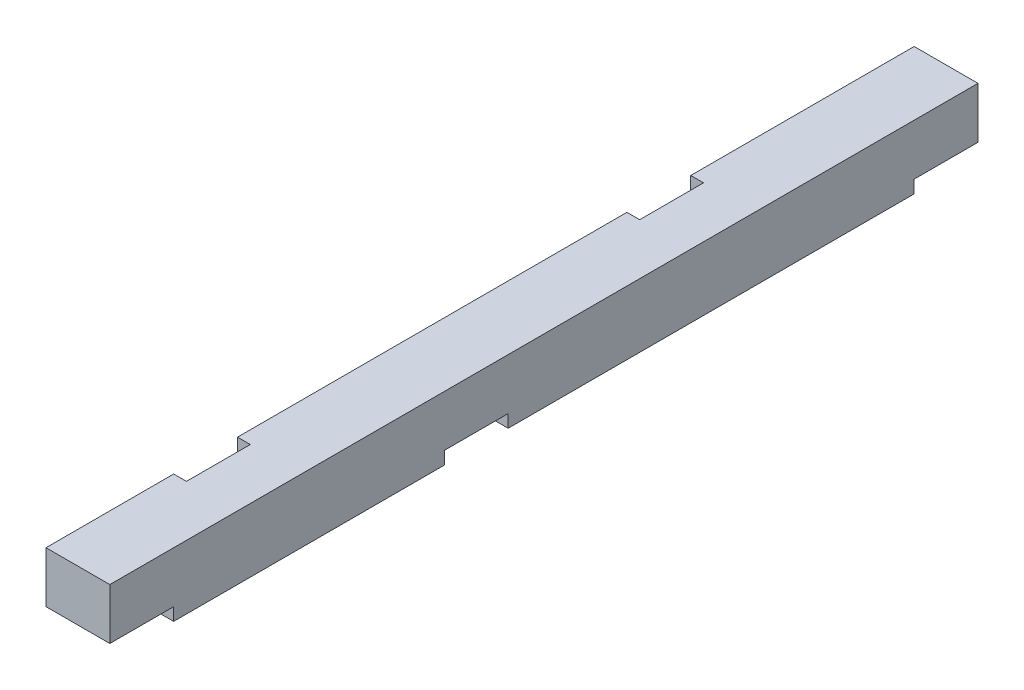
ISO-10303-21;
HEADER;
FILE_DESCRIPTION(('STEP AP214'),'2;1');
FILE_NAME('part.step','',(''),(''),'','','');
FILE_SCHEMA(('AUTOMOTIVE_DESIGN { 1 0 10303 214 1 1 1 1 }'));
ENDSEC;
DATA;
#1=APPLICATION_CONTEXT('core data for automotive mechanical design processes');
#2=APPLICATION_PROTOCOL_DEFINITION('international standard','automotive_design',2000,#1);
#3=PRODUCT_CONTEXT('',#1,'mechanical');
#4=PRODUCT('Part','Part','',(#3));
#5=PRODUCT_RELATED_PRODUCT_CATEGORY('part','',(#4));
#6=PRODUCT_DEFINITION_FORMATION('','',#4);
#7=PRODUCT_DEFINITION_CONTEXT('part definition',#1,'design');
#8=PRODUCT_DEFINITION('design','',#6,#7);
#9=PRODUCT_DEFINITION_SHAPE('','',#8);
#10=(LENGTH_UNIT() NAMED_UNIT(*) SI_UNIT(.MILLI.,.METRE.));
#11=(NAMED_UNIT(*) PLANE_ANGLE_UNIT() SI_UNIT($,.RADIAN.));
#12=(NAMED_UNIT(*) SI_UNIT($,.STERADIAN.) SOLID_ANGLE_UNIT());
#13=UNCERTAINTY_MEASURE_WITH_UNIT(LENGTH_MEASURE(1.E-05),#10,'distance_accuracy_value','');
#14=(GEOMETRIC_REPRESENTATION_CONTEXT(3) GLOBAL_UNCERTAINTY_ASSIGNED_CONTEXT((#13)) GLOBAL_UNIT_ASSIGNED_CONTEXT((#10,
#11,#12)) REPRESENTATION_CONTEXT('',''));
#15=CARTESIAN_POINT('',(0.,0.,0.));
#16=DIRECTION('',(0.,0.,1.));
#17=DIRECTION('',(1.,0.,0.));
#18=AXIS2_PLACEMENT_3D('',#15,#16,#17);
#19=CARTESIAN_POINT('',(0.,0.,136.));
#20=DIRECTION('',(1.,0.,0.));
#21=DIRECTION('',(0.,0.,-1.));
#22=AXIS2_PLACEMENT_3D('',#19,#20,#21);
#23=PLANE('',#22);
#24=DIRECTION('',(0.,0.,-1.));
#25=VECTOR('',#24,1.);
#26=CARTESIAN_POINT('',(0.,0.,136.));
#27=LINE('',#26,#25);
#28=CARTESIAN_POINT('',(0.,0.,106.));
#29=VERTEX_POINT('',#28);
#30=CARTESIAN_POINT('',(0.,0.,83.6));
#31=VERTEX_POINT('',#30);
#32=EDGE_CURVE('E41',#29,#31,#27,.T.);
#33=ORIENTED_EDGE('',*,*,#32,.F.);
#34=DIRECTION('',(0.,-1.,0.));
#35=VECTOR('',#34,1.);
#36=CARTESIAN_POINT('',(0.,10.,106.));
#37=LINE('',#36,#35);
#38=CARTESIAN_POINT('',(0.,10.,106.));
#39=VERTEX_POINT('',#38);
#40=EDGE_CURVE('E177',#39,#29,#37,.T.);
#41=ORIENTED_EDGE('',*,*,#40,.F.);
#42=DIRECTION('',(0.,0.,-1.));
#43=VECTOR('',#42,1.);
#44=CARTESIAN_POINT('',(0.,10.,136.));
#45=LINE('',#44,#43);
#46=CARTESIAN_POINT('',(0.,10.,45.));
#47=VERTEX_POINT('',#46);
#48=EDGE_CURVE('E309',#39,#47,#45,.T.);
#49=ORIENTED_EDGE('',*,*,#48,.T.);
#50=DIRECTION('',(0.,1.,0.));
#51=VECTOR('',#50,1.);
#52=CARTESIAN_POINT('',(0.,10.,45.));
#53=LINE('',#52,#51);
#54=CARTESIAN_POINT('',(0.,0.,45.));
#55=VERTEX_POINT('',#54);
#56=EDGE_CURVE('E209',#55,#47,#53,.T.);
#57=ORIENTED_EDGE('',*,*,#56,.F.);
#58=CARTESIAN_POINT('',(0.,0.,73.6));
#59=VERTEX_POINT('',#58);
#60=EDGE_CURVE('E42',#59,#55,#27,.T.);
#61=ORIENTED_EDGE('',*,*,#60,.F.);
#62=DIRECTION('',(0.,1.,0.));
#63=VECTOR('',#62,1.);
#64=CARTESIAN_POINT('',(0.,2.,73.6));
#65=LINE('',#64,#63);
#66=CARTESIAN_POINT('',(0.,2.,73.6));
#67=VERTEX_POINT('',#66);
#68=EDGE_CURVE('E231',#59,#67,#65,.T.);
#69=ORIENTED_EDGE('',*,*,#68,.T.);
#70=DIRECTION('',(0.,0.,1.));
#71=VECTOR('',#70,1.);
#72=CARTESIAN_POINT('',(0.,2.,83.6));
#73=LINE('',#72,#71);
#74=CARTESIAN_POINT('',(0.,2.,83.6));
#75=VERTEX_POINT('',#74);
#76=EDGE_CURVE('E235',#67,#75,#73,.T.);
#77=ORIENTED_EDGE('',*,*,#76,.T.);
#78=DIRECTION('',(0.,-1.,0.));
#79=VECTOR('',#78,1.);
#80=CARTESIAN_POINT('',(0.,2.,83.6));
#81=LINE('',#80,#79);
#82=EDGE_CURVE('E228',#75,#31,#81,.T.);
#83=ORIENTED_EDGE('',*,*,#82,.T.);
#84=EDGE_LOOP('',(#33,#41,#49,#57,#61,#69,#77,#83));
#85=FACE_BOUND('',#84,.T.);
#86=ADVANCED_FACE('F33',(#85),#23,.F.);
#87=CARTESIAN_POINT('',(0.,0.,35.));
#88=VERTEX_POINT('',#87);
#89=CARTESIAN_POINT('',(0.,0.,10.));
#90=VERTEX_POINT('',#89);
#91=EDGE_CURVE('E314',#88,#90,#27,.T.);
#92=ORIENTED_EDGE('',*,*,#91,.F.);
#93=DIRECTION('',(0.,-1.,0.));
#94=VECTOR('',#93,1.);
#95=CARTESIAN_POINT('',(0.,10.,35.));
#96=LINE('',#95,#94);
#97=CARTESIAN_POINT('',(0.,10.,35.));
#98=VERTEX_POINT('',#97);
#99=EDGE_CURVE('E200',#98,#88,#96,.T.);
#100=ORIENTED_EDGE('',*,*,#99,.F.);
#101=CARTESIAN_POINT('',(0.,10.,0.));
#102=VERTEX_POINT('',#101);
#103=EDGE_CURVE('E298',#98,#102,#45,.T.);
#104=ORIENTED_EDGE('',*,*,#103,.T.);
#105=DIRECTION('',(0.,-1.,0.));
#106=VECTOR('',#105,1.);
#107=CARTESIAN_POINT('',(0.,0.,0.));
#108=LINE('',#107,#106);
#109=CARTESIAN_POINT('',(0.,2.,0.));
#110=VERTEX_POINT('',#109);
#111=EDGE_CURVE('E286',#102,#110,#108,.T.);
#112=ORIENTED_EDGE('',*,*,#111,.T.);
#113=DIRECTION('',(0.,0.,1.));
#114=VECTOR('',#113,1.);
#115=CARTESIAN_POINT('',(0.,2.,10.));
#116=LINE('',#115,#114);
#117=CARTESIAN_POINT('',(0.,2.,10.));
#118=VERTEX_POINT('',#117);
#119=EDGE_CURVE('E259',#110,#118,#116,.T.);
#120=ORIENTED_EDGE('',*,*,#119,.T.);
#121=DIRECTION('',(0.,-1.,0.));
#122=VECTOR('',#121,1.);
#123=CARTESIAN_POINT('',(0.,2.,10.));
#124=LINE('',#123,#122);
#125=EDGE_CURVE('E256',#118,#90,#124,.T.);
#126=ORIENTED_EDGE('',*,*,#125,.T.);
#127=EDGE_LOOP('',(#92,#100,#104,#112,#120,#126));
#128=FACE_BOUND('',#127,.T.);
#129=ADVANCED_FACE('F338',(#128),#23,.F.);
#130=CARTESIAN_POINT('',(0.,0.,136.));
#131=DIRECTION('',(0.,1.,0.));
#132=DIRECTION('',(0.,0.,1.));
#133=AXIS2_PLACEMENT_3D('',#130,#131,#132);
#134=PLANE('',#133);
#135=DIRECTION('',(0.,0.,1.));
#136=VECTOR('',#135,1.);
#137=CARTESIAN_POINT('',(2.,0.,106.));
#138=LINE('',#137,#136);
#139=CARTESIAN_POINT('',(2.,0.,106.));
#140=VERTEX_POINT('',#139);
#141=CARTESIAN_POINT('',(2.,0.,116.));
#142=VERTEX_POINT('',#141);
#143=EDGE_CURVE('E185',#140,#142,#138,.T.);
#144=ORIENTED_EDGE('',*,*,#143,.F.);
#145=DIRECTION('',(-1.,0.,0.));
#146=VECTOR('',#145,1.);
#147=CARTESIAN_POINT('',(2.,0.,106.));
#148=LINE('',#147,#146);
#149=EDGE_CURVE('E172',#140,#29,#148,.T.);
#150=ORIENTED_EDGE('',*,*,#149,.T.);
#151=ORIENTED_EDGE('',*,*,#32,.T.);
#152=DIRECTION('',(1.,0.,0.));
#153=VECTOR('',#152,1.);
#154=CARTESIAN_POINT('',(0.,0.,83.6));
#155=LINE('',#154,#153);
#156=CARTESIAN_POINT('',(10.,0.,83.6));
#157=VERTEX_POINT('',#156);
#158=EDGE_CURVE('E238',#31,#157,#155,.T.);
#159=ORIENTED_EDGE('',*,*,#158,.T.);
#160=DIRECTION('',(0.,0.,-1.));
#161=VECTOR('',#160,1.);
#162=CARTESIAN_POINT('',(10.,0.,136.));
#163=LINE('',#162,#161);
#164=CARTESIAN_POINT('',(10.,0.,126.));
#165=VERTEX_POINT('',#164);
#166=EDGE_CURVE('E312',#165,#157,#163,.T.);
#167=ORIENTED_EDGE('',*,*,#166,.F.);
#168=DIRECTION('',(1.,0.,0.));
#169=VECTOR('',#168,1.);
#170=CARTESIAN_POINT('',(0.,0.,126.));
#171=LINE('',#170,#169);
#172=CARTESIAN_POINT('',(0.,0.,126.));
#173=VERTEX_POINT('',#172);
#174=EDGE_CURVE('E279',#173,#165,#171,.T.);
#175=ORIENTED_EDGE('',*,*,#174,.F.);
#176=CARTESIAN_POINT('',(0.,0.,116.));
#177=VERTEX_POINT('',#176);
#178=EDGE_CURVE('E11',#173,#177,#27,.T.);
#179=ORIENTED_EDGE('',*,*,#178,.T.);
#180=DIRECTION('',(-1.,0.,0.));
#181=VECTOR('',#180,1.);
#182=CARTESIAN_POINT('',(2.,0.,116.));
#183=LINE('',#182,#181);
#184=EDGE_CURVE('E181',#142,#177,#183,.T.);
#185=ORIENTED_EDGE('',*,*,#184,.F.);
#186=EDGE_LOOP('',(#144,#150,#151,#159,#167,#175,#179,#185));
#187=FACE_BOUND('',#186,.T.);
#188=ADVANCED_FACE('F191',(#187),#134,.F.);
#189=CARTESIAN_POINT('',(0.,10.,136.));
#190=VERTEX_POINT('',#189);
#191=CARTESIAN_POINT('',(0.,10.,116.));
#192=VERTEX_POINT('',#191);
#193=EDGE_CURVE('E305',#190,#192,#45,.T.);
#194=ORIENTED_EDGE('',*,*,#193,.T.);
#195=DIRECTION('',(0.,1.,0.));
#196=VECTOR('',#195,1.);
#197=CARTESIAN_POINT('',(0.,10.,116.));
#198=LINE('',#197,#196);
#199=EDGE_CURVE('E189',#177,#192,#198,.T.);
#200=ORIENTED_EDGE('',*,*,#199,.F.);
#201=ORIENTED_EDGE('',*,*,#178,.F.);
#202=DIRECTION('',(0.,1.,0.));
#203=VECTOR('',#202,1.);
#204=CARTESIAN_POINT('',(0.,2.,126.));
#205=LINE('',#204,#203);
#206=CARTESIAN_POINT('',(0.,2.,126.));
#207=VERTEX_POINT('',#206);
#208=EDGE_CURVE('E272',#173,#207,#205,.T.);
#209=ORIENTED_EDGE('',*,*,#208,.T.);
#210=DIRECTION('',(0.,0.,1.));
#211=VECTOR('',#210,1.);
#212=CARTESIAN_POINT('',(0.,2.,136.));
#213=LINE('',#212,#211);
#214=CARTESIAN_POINT('',(0.,2.,136.));
#215=VERTEX_POINT('',#214);
#216=EDGE_CURVE('E275',#207,#215,#213,.T.);
#217=ORIENTED_EDGE('',*,*,#216,.T.);
#218=DIRECTION('',(0.,-1.,0.));
#219=VECTOR('',#218,1.);
#220=CARTESIAN_POINT('',(0.,0.,136.));
#221=LINE('',#220,#219);
#222=EDGE_CURVE('E290',#190,#215,#221,.T.);
#223=ORIENTED_EDGE('',*,*,#222,.F.);
#224=EDGE_LOOP('',(#194,#200,#201,#209,#217,#223));
#225=FACE_BOUND('',#224,.T.);
#226=ADVANCED_FACE('F35',(#225),#23,.F.);
#227=DIRECTION('',(0.,0.,1.));
#228=VECTOR('',#227,1.);
#229=CARTESIAN_POINT('',(2.,0.,35.));
#230=LINE('',#229,#228);
#231=CARTESIAN_POINT('',(2.,0.,35.));
#232=VERTEX_POINT('',#231);
#233=CARTESIAN_POINT('',(2.,0.,45.));
#234=VERTEX_POINT('',#233);
#235=EDGE_CURVE('E208',#232,#234,#230,.T.);
#236=ORIENTED_EDGE('',*,*,#235,.F.);
#237=DIRECTION('',(-1.,0.,0.));
#238=VECTOR('',#237,1.);
#239=CARTESIAN_POINT('',(2.,0.,35.));
#240=LINE('',#239,#238);
#241=EDGE_CURVE('E214',#232,#88,#240,.T.);
#242=ORIENTED_EDGE('',*,*,#241,.T.);
#243=ORIENTED_EDGE('',*,*,#91,.T.);
#244=DIRECTION('',(1.,0.,0.));
#245=VECTOR('',#244,1.);
#246=CARTESIAN_POINT('',(0.,0.,10.));
#247=LINE('',#246,#245);
#248=CARTESIAN_POINT('',(10.,0.,10.));
#249=VERTEX_POINT('',#248);
#250=EDGE_CURVE('E263',#90,#249,#247,.T.);
#251=ORIENTED_EDGE('',*,*,#250,.T.);
#252=CARTESIAN_POINT('',(10.,0.,73.6));
#253=VERTEX_POINT('',#252);
#254=EDGE_CURVE('E311',#253,#249,#163,.T.);
#255=ORIENTED_EDGE('',*,*,#254,.F.);
#256=DIRECTION('',(1.,0.,0.));
#257=VECTOR('',#256,1.);
#258=CARTESIAN_POINT('',(0.,0.,73.6));
#259=LINE('',#258,#257);
#260=EDGE_CURVE('E252',#59,#253,#259,.T.);
#261=ORIENTED_EDGE('',*,*,#260,.F.);
#262=ORIENTED_EDGE('',*,*,#60,.T.);
#263=DIRECTION('',(-1.,0.,0.));
#264=VECTOR('',#263,1.);
#265=CARTESIAN_POINT('',(2.,0.,45.));
#266=LINE('',#265,#264);
#267=EDGE_CURVE('E224',#234,#55,#266,.T.);
#268=ORIENTED_EDGE('',*,*,#267,.F.);
#269=EDGE_LOOP('',(#236,#242,#243,#251,#255,#261,#262,#268));
#270=FACE_BOUND('',#269,.T.);
#271=ADVANCED_FACE('F329',(#270),#134,.F.);
#272=CARTESIAN_POINT('',(10.,0.,136.));
#273=DIRECTION('',(-1.,0.,0.));
#274=DIRECTION('',(0.,0.,1.));
#275=AXIS2_PLACEMENT_3D('',#272,#273,#274);
#276=PLANE('',#275);
#277=ORIENTED_EDGE('',*,*,#166,.T.);
#278=DIRECTION('',(0.,-1.,0.));
#279=VECTOR('',#278,1.);
#280=CARTESIAN_POINT('',(10.,2.,83.6));
#281=LINE('',#280,#279);
#282=CARTESIAN_POINT('',(10.,2.,83.6));
#283=VERTEX_POINT('',#282);
#284=EDGE_CURVE('E239',#283,#157,#281,.T.);
#285=ORIENTED_EDGE('',*,*,#284,.F.);
#286=DIRECTION('',(0.,0.,1.));
#287=VECTOR('',#286,1.);
#288=CARTESIAN_POINT('',(10.,2.,83.6));
#289=LINE('',#288,#287);
#290=CARTESIAN_POINT('',(10.,2.,73.6));
#291=VERTEX_POINT('',#290);
#292=EDGE_CURVE('E232',#291,#283,#289,.T.);
#293=ORIENTED_EDGE('',*,*,#292,.F.);
#294=DIRECTION('',(0.,1.,0.));
#295=VECTOR('',#294,1.);
#296=CARTESIAN_POINT('',(10.,2.,73.6));
#297=LINE('',#296,#295);
#298=EDGE_CURVE('E241',#253,#291,#297,.T.);
#299=ORIENTED_EDGE('',*,*,#298,.F.);
#300=ORIENTED_EDGE('',*,*,#254,.T.);
#301=DIRECTION('',(0.,-1.,0.));
#302=VECTOR('',#301,1.);
#303=CARTESIAN_POINT('',(10.,2.,10.));
#304=LINE('',#303,#302);
#305=CARTESIAN_POINT('',(10.,2.,10.));
#306=VERTEX_POINT('',#305);
#307=EDGE_CURVE('E220',#306,#249,#304,.T.);
#308=ORIENTED_EDGE('',*,*,#307,.F.);
#309=DIRECTION('',(0.,0.,1.));
#310=VECTOR('',#309,1.);
#311=CARTESIAN_POINT('',(10.,2.,10.));
#312=LINE('',#311,#310);
#313=CARTESIAN_POINT('',(10.,2.,0.));
#314=VERTEX_POINT('',#313);
#315=EDGE_CURVE('E260',#314,#306,#312,.T.);
#316=ORIENTED_EDGE('',*,*,#315,.F.);
#317=DIRECTION('',(0.,1.,0.));
#318=VECTOR('',#317,1.);
#319=CARTESIAN_POINT('',(10.,0.,0.));
#320=LINE('',#319,#318);
#321=CARTESIAN_POINT('',(10.,10.,0.));
#322=VERTEX_POINT('',#321);
#323=EDGE_CURVE('E301',#314,#322,#320,.T.);
#324=ORIENTED_EDGE('',*,*,#323,.T.);
#325=DIRECTION('',(0.,0.,-1.));
#326=VECTOR('',#325,1.);
#327=CARTESIAN_POINT('',(10.,10.,136.));
#328=LINE('',#327,#326);
#329=CARTESIAN_POINT('',(10.,10.,136.));
#330=VERTEX_POINT('',#329);
#331=EDGE_CURVE('E308',#330,#322,#328,.T.);
#332=ORIENTED_EDGE('',*,*,#331,.F.);
#333=DIRECTION('',(0.,1.,0.));
#334=VECTOR('',#333,1.);
#335=CARTESIAN_POINT('',(10.,0.,136.));
#336=LINE('',#335,#334);
#337=CARTESIAN_POINT('',(10.,2.,136.));
#338=VERTEX_POINT('',#337);
#339=EDGE_CURVE('E293',#338,#330,#336,.T.);
#340=ORIENTED_EDGE('',*,*,#339,.F.);
#341=DIRECTION('',(0.,0.,1.));
#342=VECTOR('',#341,1.);
#343=CARTESIAN_POINT('',(10.,2.,136.));
#344=LINE('',#343,#342);
#345=CARTESIAN_POINT('',(10.,2.,126.));
#346=VERTEX_POINT('',#345);
#347=EDGE_CURVE('E276',#346,#338,#344,.T.);
#348=ORIENTED_EDGE('',*,*,#347,.F.);
#349=DIRECTION('',(0.,1.,0.));
#350=VECTOR('',#349,1.);
#351=CARTESIAN_POINT('',(10.,2.,126.));
#352=LINE('',#351,#350);
#353=EDGE_CURVE('E249',#165,#346,#352,.T.);
#354=ORIENTED_EDGE('',*,*,#353,.F.);
#355=EDGE_LOOP('',(#277,#285,#293,#299,#300,#308,#316,#324,#332,#340,#348,#354));
#356=FACE_BOUND('',#355,.T.);
#357=ADVANCED_FACE('F323',(#356),#276,.F.);
#358=CARTESIAN_POINT('',(0.,10.,136.));
#359=DIRECTION('',(0.,-1.,0.));
#360=DIRECTION('',(0.,0.,-1.));
#361=AXIS2_PLACEMENT_3D('',#358,#359,#360);
#362=PLANE('',#361);
#363=ORIENTED_EDGE('',*,*,#48,.F.);
#364=DIRECTION('',(-1.,0.,0.));
#365=VECTOR('',#364,1.);
#366=CARTESIAN_POINT('',(2.,10.,106.));
#367=LINE('',#366,#365);
#368=CARTESIAN_POINT('',(2.,10.,106.));
#369=VERTEX_POINT('',#368);
#370=EDGE_CURVE('E198',#369,#39,#367,.T.);
#371=ORIENTED_EDGE('',*,*,#370,.F.);
#372=DIRECTION('',(0.,0.,-1.));
#373=VECTOR('',#372,1.);
#374=CARTESIAN_POINT('',(2.,10.,106.));
#375=LINE('',#374,#373);
#376=CARTESIAN_POINT('',(2.,10.,116.));
#377=VERTEX_POINT('',#376);
#378=EDGE_CURVE('E182',#377,#369,#375,.T.);
#379=ORIENTED_EDGE('',*,*,#378,.F.);
#380=DIRECTION('',(-1.,0.,0.));
#381=VECTOR('',#380,1.);
#382=CARTESIAN_POINT('',(2.,10.,116.));
#383=LINE('',#382,#381);
#384=EDGE_CURVE('E201',#377,#192,#383,.T.);
#385=ORIENTED_EDGE('',*,*,#384,.T.);
#386=ORIENTED_EDGE('',*,*,#193,.F.);
#387=DIRECTION('',(-1.,0.,0.));
#388=VECTOR('',#387,1.);
#389=CARTESIAN_POINT('',(0.,10.,136.));
#390=LINE('',#389,#388);
#391=EDGE_CURVE('E296',#330,#190,#390,.T.);
#392=ORIENTED_EDGE('',*,*,#391,.F.);
#393=ORIENTED_EDGE('',*,*,#331,.T.);
#394=DIRECTION('',(-1.,0.,0.));
#395=VECTOR('',#394,1.);
#396=CARTESIAN_POINT('',(0.,10.,0.));
#397=LINE('',#396,#395);
#398=EDGE_CURVE('E294',#322,#102,#397,.T.);
#399=ORIENTED_EDGE('',*,*,#398,.T.);
#400=ORIENTED_EDGE('',*,*,#103,.F.);
#401=DIRECTION('',(-1.,0.,0.));
#402=VECTOR('',#401,1.);
#403=CARTESIAN_POINT('',(2.,10.,35.));
#404=LINE('',#403,#402);
#405=CARTESIAN_POINT('',(2.,10.,35.));
#406=VERTEX_POINT('',#405);
#407=EDGE_CURVE('E218',#406,#98,#404,.T.);
#408=ORIENTED_EDGE('',*,*,#407,.F.);
#409=DIRECTION('',(0.,0.,-1.));
#410=VECTOR('',#409,1.);
#411=CARTESIAN_POINT('',(2.,10.,35.));
#412=LINE('',#411,#410);
#413=CARTESIAN_POINT('',(2.,10.,45.));
#414=VERTEX_POINT('',#413);
#415=EDGE_CURVE('E212',#414,#406,#412,.T.);
#416=ORIENTED_EDGE('',*,*,#415,.F.);
#417=DIRECTION('',(-1.,0.,0.));
#418=VECTOR('',#417,1.);
#419=CARTESIAN_POINT('',(2.,10.,45.));
#420=LINE('',#419,#418);
#421=EDGE_CURVE('E221',#414,#47,#420,.T.);
#422=ORIENTED_EDGE('',*,*,#421,.T.);
#423=EDGE_LOOP('',(#363,#371,#379,#385,#386,#392,#393,#399,#400,#408,#416,#422));
#424=FACE_BOUND('',#423,.T.);
#425=ADVANCED_FACE('F353',(#424),#362,.F.);
#426=CARTESIAN_POINT('',(0.,0.,136.));
#427=DIRECTION('',(0.,0.,-1.));
#428=DIRECTION('',(-1.,0.,0.));
#429=AXIS2_PLACEMENT_3D('',#426,#427,#428);
#430=PLANE('',#429);
#431=ORIENTED_EDGE('',*,*,#222,.T.);
#432=DIRECTION('',(1.,0.,0.));
#433=VECTOR('',#432,1.);
#434=CARTESIAN_POINT('',(0.,2.,136.));
#435=LINE('',#434,#433);
#436=EDGE_CURVE('E283',#215,#338,#435,.T.);
#437=ORIENTED_EDGE('',*,*,#436,.T.);
#438=ORIENTED_EDGE('',*,*,#339,.T.);
#439=ORIENTED_EDGE('',*,*,#391,.T.);
#440=EDGE_LOOP('',(#431,#437,#438,#439));
#441=FACE_BOUND('',#440,.T.);
#442=ADVANCED_FACE('F358',(#441),#430,.F.);
#443=CARTESIAN_POINT('',(0.,0.,0.));
#444=DIRECTION('',(0.,0.,-1.));
#445=DIRECTION('',(-1.,0.,0.));
#446=AXIS2_PLACEMENT_3D('',#443,#444,#445);
#447=PLANE('',#446);
#448=DIRECTION('',(1.,0.,0.));
#449=VECTOR('',#448,1.);
#450=CARTESIAN_POINT('',(0.,2.,0.));
#451=LINE('',#450,#449);
#452=EDGE_CURVE('E268',#110,#314,#451,.T.);
#453=ORIENTED_EDGE('',*,*,#452,.F.);
#454=ORIENTED_EDGE('',*,*,#111,.F.);
#455=ORIENTED_EDGE('',*,*,#398,.F.);
#456=ORIENTED_EDGE('',*,*,#323,.F.);
#457=EDGE_LOOP('',(#453,#454,#455,#456));
#458=FACE_BOUND('',#457,.T.);
#459=ADVANCED_FACE('F346',(#458),#447,.T.);
#460=CARTESIAN_POINT('',(0.,2.,136.));
#461=DIRECTION('',(0.,1.,0.));
#462=DIRECTION('',(0.,0.,1.));
#463=AXIS2_PLACEMENT_3D('',#460,#461,#462);
#464=PLANE('',#463);
#465=ORIENTED_EDGE('',*,*,#347,.T.);
#466=ORIENTED_EDGE('',*,*,#436,.F.);
#467=ORIENTED_EDGE('',*,*,#216,.F.);
#468=DIRECTION('',(1.,0.,0.));
#469=VECTOR('',#468,1.);
#470=CARTESIAN_POINT('',(0.,2.,126.));
#471=LINE('',#470,#469);
#472=EDGE_CURVE('E287',#207,#346,#471,.T.);
#473=ORIENTED_EDGE('',*,*,#472,.T.);
#474=EDGE_LOOP('',(#465,#466,#467,#473));
#475=FACE_BOUND('',#474,.T.);
#476=ADVANCED_FACE('F361',(#475),#464,.F.);
#477=CARTESIAN_POINT('',(0.,2.,126.));
#478=DIRECTION('',(0.,0.,-1.));
#479=DIRECTION('',(-1.,0.,0.));
#480=AXIS2_PLACEMENT_3D('',#477,#478,#479);
#481=PLANE('',#480);
#482=ORIENTED_EDGE('',*,*,#353,.T.);
#483=ORIENTED_EDGE('',*,*,#472,.F.);
#484=ORIENTED_EDGE('',*,*,#208,.F.);
#485=ORIENTED_EDGE('',*,*,#174,.T.);
#486=EDGE_LOOP('',(#482,#483,#484,#485));
#487=FACE_BOUND('',#486,.T.);
#488=ADVANCED_FACE('F364',(#487),#481,.F.);
#489=CARTESIAN_POINT('',(0.,2.,10.));
#490=DIRECTION('',(0.,0.,1.));
#491=DIRECTION('',(0.,-1.,0.));
#492=AXIS2_PLACEMENT_3D('',#489,#490,#491);
#493=PLANE('',#492);
#494=ORIENTED_EDGE('',*,*,#307,.T.);
#495=ORIENTED_EDGE('',*,*,#250,.F.);
#496=ORIENTED_EDGE('',*,*,#125,.F.);
#497=DIRECTION('',(1.,0.,0.));
#498=VECTOR('',#497,1.);
#499=CARTESIAN_POINT('',(0.,2.,10.));
#500=LINE('',#499,#498);
#501=EDGE_CURVE('E242',#118,#306,#500,.T.);
#502=ORIENTED_EDGE('',*,*,#501,.T.);
#503=EDGE_LOOP('',(#494,#495,#496,#502));
#504=FACE_BOUND('',#503,.T.);
#505=ADVANCED_FACE('F336',(#504),#493,.F.);
#506=CARTESIAN_POINT('',(0.,2.,10.));
#507=DIRECTION('',(0.,1.,0.));
#508=DIRECTION('',(0.,0.,1.));
#509=AXIS2_PLACEMENT_3D('',#506,#507,#508);
#510=PLANE('',#509);
#511=ORIENTED_EDGE('',*,*,#315,.T.);
#512=ORIENTED_EDGE('',*,*,#501,.F.);
#513=ORIENTED_EDGE('',*,*,#119,.F.);
#514=ORIENTED_EDGE('',*,*,#452,.T.);
#515=EDGE_LOOP('',(#511,#512,#513,#514));
#516=FACE_BOUND('',#515,.T.);
#517=ADVANCED_FACE('F343',(#516),#510,.F.);
#518=CARTESIAN_POINT('',(0.,2.,83.6));
#519=DIRECTION('',(0.,0.,1.));
#520=DIRECTION('',(1.,0.,0.));
#521=AXIS2_PLACEMENT_3D('',#518,#519,#520);
#522=PLANE('',#521);
#523=ORIENTED_EDGE('',*,*,#284,.T.);
#524=ORIENTED_EDGE('',*,*,#158,.F.);
#525=ORIENTED_EDGE('',*,*,#82,.F.);
#526=DIRECTION('',(1.,0.,0.));
#527=VECTOR('',#526,1.);
#528=CARTESIAN_POINT('',(0.,2.,83.6));
#529=LINE('',#528,#527);
#530=EDGE_CURVE('E247',#75,#283,#529,.T.);
#531=ORIENTED_EDGE('',*,*,#530,.T.);
#532=EDGE_LOOP('',(#523,#524,#525,#531));
#533=FACE_BOUND('',#532,.T.);
#534=ADVANCED_FACE('F423',(#533),#522,.F.);
#535=CARTESIAN_POINT('',(0.,2.,83.6));
#536=DIRECTION('',(0.,1.,0.));
#537=DIRECTION('',(0.,0.,1.));
#538=AXIS2_PLACEMENT_3D('',#535,#536,#537);
#539=PLANE('',#538);
#540=ORIENTED_EDGE('',*,*,#292,.T.);
#541=ORIENTED_EDGE('',*,*,#530,.F.);
#542=ORIENTED_EDGE('',*,*,#76,.F.);
#543=DIRECTION('',(1.,0.,0.));
#544=VECTOR('',#543,1.);
#545=CARTESIAN_POINT('',(0.,2.,73.6));
#546=LINE('',#545,#544);
#547=EDGE_CURVE('E250',#67,#291,#546,.T.);
#548=ORIENTED_EDGE('',*,*,#547,.T.);
#549=EDGE_LOOP('',(#540,#541,#542,#548));
#550=FACE_BOUND('',#549,.T.);
#551=ADVANCED_FACE('F391',(#550),#539,.F.);
#552=CARTESIAN_POINT('',(0.,2.,73.6));
#553=DIRECTION('',(0.,0.,-1.));
#554=DIRECTION('',(-1.,0.,0.));
#555=AXIS2_PLACEMENT_3D('',#552,#553,#554);
#556=PLANE('',#555);
#557=ORIENTED_EDGE('',*,*,#298,.T.);
#558=ORIENTED_EDGE('',*,*,#547,.F.);
#559=ORIENTED_EDGE('',*,*,#68,.F.);
#560=ORIENTED_EDGE('',*,*,#260,.T.);
#561=EDGE_LOOP('',(#557,#558,#559,#560));
#562=FACE_BOUND('',#561,.T.);
#563=ADVANCED_FACE('F384',(#562),#556,.F.);
#564=CARTESIAN_POINT('',(2.,10.,35.));
#565=DIRECTION('',(0.,0.,-1.));
#566=DIRECTION('',(-1.,0.,0.));
#567=AXIS2_PLACEMENT_3D('',#564,#565,#566);
#568=PLANE('',#567);
#569=ORIENTED_EDGE('',*,*,#99,.T.);
#570=ORIENTED_EDGE('',*,*,#241,.F.);
#571=DIRECTION('',(0.,-1.,0.));
#572=VECTOR('',#571,1.);
#573=CARTESIAN_POINT('',(2.,10.,35.));
#574=LINE('',#573,#572);
#575=EDGE_CURVE('E205',#406,#232,#574,.T.);
#576=ORIENTED_EDGE('',*,*,#575,.F.);
#577=ORIENTED_EDGE('',*,*,#407,.T.);
#578=EDGE_LOOP('',(#569,#570,#576,#577));
#579=FACE_BOUND('',#578,.T.);
#580=ADVANCED_FACE('F382',(#579),#568,.F.);
#581=CARTESIAN_POINT('',(2.,10.,45.));
#582=DIRECTION('',(0.,0.,1.));
#583=DIRECTION('',(1.,0.,0.));
#584=AXIS2_PLACEMENT_3D('',#581,#582,#583);
#585=PLANE('',#584);
#586=ORIENTED_EDGE('',*,*,#56,.T.);
#587=ORIENTED_EDGE('',*,*,#421,.F.);
#588=DIRECTION('',(0.,1.,0.));
#589=VECTOR('',#588,1.);
#590=CARTESIAN_POINT('',(2.,10.,45.));
#591=LINE('',#590,#589);
#592=EDGE_CURVE('E57',#234,#414,#591,.T.);
#593=ORIENTED_EDGE('',*,*,#592,.F.);
#594=ORIENTED_EDGE('',*,*,#267,.T.);
#595=EDGE_LOOP('',(#586,#587,#593,#594));
#596=FACE_BOUND('',#595,.T.);
#597=ADVANCED_FACE('F377',(#596),#585,.F.);
#598=CARTESIAN_POINT('',(2.,0.,0.));
#599=DIRECTION('',(-1.,0.,0.));
#600=DIRECTION('',(0.,0.,1.));
#601=AXIS2_PLACEMENT_3D('',#598,#599,#600);
#602=PLANE('',#601);
#603=ORIENTED_EDGE('',*,*,#575,.T.);
#604=ORIENTED_EDGE('',*,*,#235,.T.);
#605=ORIENTED_EDGE('',*,*,#592,.T.);
#606=ORIENTED_EDGE('',*,*,#415,.T.);
#607=EDGE_LOOP('',(#603,#604,#605,#606));
#608=FACE_BOUND('',#607,.T.);
#609=ADVANCED_FACE('F380',(#608),#602,.T.);
#610=CARTESIAN_POINT('',(2.,10.,106.));
#611=DIRECTION('',(0.,0.,-1.));
#612=DIRECTION('',(-1.,0.,0.));
#613=AXIS2_PLACEMENT_3D('',#610,#611,#612);
#614=PLANE('',#613);
#615=ORIENTED_EDGE('',*,*,#40,.T.);
#616=ORIENTED_EDGE('',*,*,#149,.F.);
#617=DIRECTION('',(0.,-1.,0.));
#618=VECTOR('',#617,1.);
#619=CARTESIAN_POINT('',(2.,10.,106.));
#620=LINE('',#619,#618);
#621=EDGE_CURVE('E175',#369,#140,#620,.T.);
#622=ORIENTED_EDGE('',*,*,#621,.F.);
#623=ORIENTED_EDGE('',*,*,#370,.T.);
#624=EDGE_LOOP('',(#615,#616,#622,#623));
#625=FACE_BOUND('',#624,.T.);
#626=ADVANCED_FACE('F174',(#625),#614,.F.);
#627=CARTESIAN_POINT('',(2.,10.,116.));
#628=DIRECTION('',(0.,0.,1.));
#629=DIRECTION('',(1.,0.,0.));
#630=AXIS2_PLACEMENT_3D('',#627,#628,#629);
#631=PLANE('',#630);
#632=ORIENTED_EDGE('',*,*,#199,.T.);
#633=ORIENTED_EDGE('',*,*,#384,.F.);
#634=DIRECTION('',(0.,1.,0.));
#635=VECTOR('',#634,1.);
#636=CARTESIAN_POINT('',(2.,10.,116.));
#637=LINE('',#636,#635);
#638=EDGE_CURVE('E49',#142,#377,#637,.T.);
#639=ORIENTED_EDGE('',*,*,#638,.F.);
#640=ORIENTED_EDGE('',*,*,#184,.T.);
#641=EDGE_LOOP('',(#632,#633,#639,#640));
#642=FACE_BOUND('',#641,.T.);
#643=ADVANCED_FACE('F370',(#642),#631,.F.);
#644=CARTESIAN_POINT('',(2.,0.,0.));
#645=DIRECTION('',(-1.,0.,0.));
#646=DIRECTION('',(0.,0.,1.));
#647=AXIS2_PLACEMENT_3D('',#644,#645,#646);
#648=PLANE('',#647);
#649=ORIENTED_EDGE('',*,*,#621,.T.);
#650=ORIENTED_EDGE('',*,*,#143,.T.);
#651=ORIENTED_EDGE('',*,*,#638,.T.);
#652=ORIENTED_EDGE('',*,*,#378,.T.);
#653=EDGE_LOOP('',(#649,#650,#651,#652));
#654=FACE_BOUND('',#653,.T.);
#655=ADVANCED_FACE('F184',(#654),#648,.T.);
#656=CLOSED_SHELL('',(#86,#129,#188,#226,#271,#357,#425,#442,#459,#476,#488,#505,#517,#534,#551,
#563,#580,#597,#609,#626,#643,#655));
#657=MANIFOLD_SOLID_BREP('B2',#656);
#658=ADVANCED_BREP_SHAPE_REPRESENTATION('',(#18,#657),#14);
#659=SHAPE_DEFINITION_REPRESENTATION(#9,#658);
ENDSEC;
END-ISO-10303-21;
